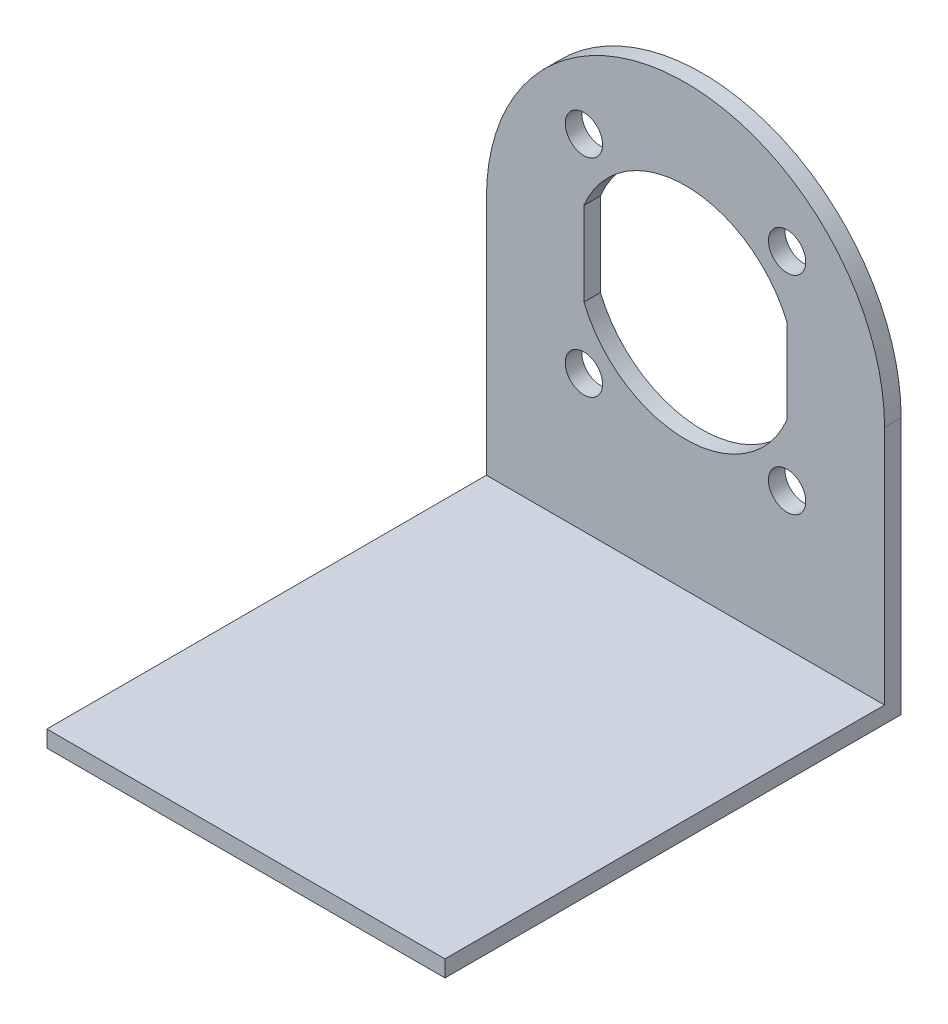
ISO-10303-21;
HEADER;
FILE_DESCRIPTION(('STEP AP214'),'2;1');
FILE_NAME('part.step','',(''),(''),'','','');
FILE_SCHEMA(('AUTOMOTIVE_DESIGN { 1 0 10303 214 1 1 1 1 }'));
ENDSEC;
DATA;
#1=APPLICATION_CONTEXT('core data for automotive mechanical design processes');
#2=APPLICATION_PROTOCOL_DEFINITION('international standard','automotive_design',2000,#1);
#3=PRODUCT_CONTEXT('',#1,'mechanical');
#4=PRODUCT('Part','Part','',(#3));
#5=PRODUCT_RELATED_PRODUCT_CATEGORY('part','',(#4));
#6=PRODUCT_DEFINITION_FORMATION('','',#4);
#7=PRODUCT_DEFINITION_CONTEXT('part definition',#1,'design');
#8=PRODUCT_DEFINITION('design','',#6,#7);
#9=PRODUCT_DEFINITION_SHAPE('','',#8);
#10=(LENGTH_UNIT() NAMED_UNIT(*) SI_UNIT(.MILLI.,.METRE.));
#11=(NAMED_UNIT(*) PLANE_ANGLE_UNIT() SI_UNIT($,.RADIAN.));
#12=(NAMED_UNIT(*) SI_UNIT($,.STERADIAN.) SOLID_ANGLE_UNIT());
#13=UNCERTAINTY_MEASURE_WITH_UNIT(LENGTH_MEASURE(1.E-05),#10,'distance_accuracy_value','');
#14=(GEOMETRIC_REPRESENTATION_CONTEXT(3) GLOBAL_UNCERTAINTY_ASSIGNED_CONTEXT((#13)) GLOBAL_UNIT_ASSIGNED_CONTEXT((#10,
#11,#12)) REPRESENTATION_CONTEXT('',''));
#15=CARTESIAN_POINT('',(0.,0.,0.));
#16=DIRECTION('',(0.,0.,1.));
#17=DIRECTION('',(1.,0.,0.));
#18=AXIS2_PLACEMENT_3D('',#15,#16,#17);
#19=CARTESIAN_POINT('',(-38.7711228765328,2.,-34.1893008273645));
#20=DIRECTION('',(0.,0.,1.));
#21=DIRECTION('',(1.,0.,0.));
#22=AXIS2_PLACEMENT_3D('',#19,#20,#21);
#23=PLANE('',#22);
#24=CARTESIAN_POINT('',(-2.52112287653278,43.49749974995,-34.1893008273645));
#25=DIRECTION('',(0.,0.,1.));
#26=DIRECTION('',(1.,0.,0.));
#27=AXIS2_PLACEMENT_3D('',#24,#25,#26);
#28=CIRCLE('',#27,2.25);
#29=CARTESIAN_POINT('',(-0.271122876532779,43.49749974995,-34.1893008273645));
#30=VERTEX_POINT('',#29);
#31=EDGE_CURVE('E388',#30,#30,#28,.T.);
#32=ORIENTED_EDGE('',*,*,#31,.T.);
#33=EDGE_LOOP('',(#32));
#34=FACE_BOUND('',#33,.T.);
#35=CARTESIAN_POINT('',(-27.0211228765328,18.50250025005,-34.1893008273645));
#36=DIRECTION('',(0.,0.,1.));
#37=DIRECTION('',(1.,0.,0.));
#38=AXIS2_PLACEMENT_3D('',#35,#36,#37);
#39=CIRCLE('',#38,2.25);
#40=CARTESIAN_POINT('',(-24.7711228765328,18.50250025005,-34.1893008273645));
#41=VERTEX_POINT('',#40);
#42=EDGE_CURVE('E389',#41,#41,#39,.T.);
#43=ORIENTED_EDGE('',*,*,#42,.T.);
#44=EDGE_LOOP('',(#43));
#45=FACE_BOUND('',#44,.T.);
#46=CARTESIAN_POINT('',(-2.52112287653278,18.50250025005,-34.1893008273645));
#47=DIRECTION('',(0.,0.,1.));
#48=DIRECTION('',(1.,0.,0.));
#49=AXIS2_PLACEMENT_3D('',#46,#47,#48);
#50=CIRCLE('',#49,2.25);
#51=CARTESIAN_POINT('',(-0.27112287653278,18.50250025005,-34.1893008273645));
#52=VERTEX_POINT('',#51);
#53=EDGE_CURVE('E394',#52,#52,#50,.T.);
#54=ORIENTED_EDGE('',*,*,#53,.T.);
#55=EDGE_LOOP('',(#54));
#56=FACE_BOUND('',#55,.T.);
#57=CARTESIAN_POINT('',(-27.0211228765328,43.49749974995,-34.1893008273645));
#58=DIRECTION('',(0.,0.,1.));
#59=DIRECTION('',(1.,0.,0.));
#60=AXIS2_PLACEMENT_3D('',#57,#58,#59);
#61=CIRCLE('',#60,2.25);
#62=CARTESIAN_POINT('',(-24.7711228765328,43.49749974995,-34.1893008273645));
#63=VERTEX_POINT('',#62);
#64=EDGE_CURVE('E397',#63,#63,#61,.T.);
#65=ORIENTED_EDGE('',*,*,#64,.T.);
#66=EDGE_LOOP('',(#65));
#67=FACE_BOUND('',#66,.T.);
#68=DIRECTION('',(0.,1.,0.));
#69=VECTOR('',#68,1.);
#70=CARTESIAN_POINT('',(-27.0211228765328,2.,-34.1893008273645));
#71=LINE('',#70,#69);
#72=CARTESIAN_POINT('',(-27.0211228765328,25.950247530819,-34.1893008273645));
#73=VERTEX_POINT('',#72);
#74=CARTESIAN_POINT('',(-27.0211228765328,36.049752469181,-34.1893008273645));
#75=VERTEX_POINT('',#74);
#76=EDGE_CURVE('E159',#73,#75,#71,.T.);
#77=ORIENTED_EDGE('',*,*,#76,.F.);
#78=CARTESIAN_POINT('',(-14.7711228765328,31.,-34.1893008273645));
#79=DIRECTION('',(0.,0.,1.));
#80=DIRECTION('',(1.,0.,0.));
#81=AXIS2_PLACEMENT_3D('',#78,#79,#80);
#82=CIRCLE('',#81,13.25);
#83=CARTESIAN_POINT('',(-2.52112287653278,25.950247530819,-34.1893008273645));
#84=VERTEX_POINT('',#83);
#85=EDGE_CURVE('E161',#73,#84,#82,.T.);
#86=ORIENTED_EDGE('',*,*,#85,.T.);
#87=DIRECTION('',(0.,1.,0.));
#88=VECTOR('',#87,1.);
#89=CARTESIAN_POINT('',(-2.52112287653278,2.,-34.1893008273645));
#90=LINE('',#89,#88);
#91=CARTESIAN_POINT('',(-2.52112287653278,36.049752469181,-34.1893008273645));
#92=VERTEX_POINT('',#91);
#93=EDGE_CURVE('E154',#84,#92,#90,.T.);
#94=ORIENTED_EDGE('',*,*,#93,.T.);
#95=CARTESIAN_POINT('',(-14.7711228765328,31.,-34.1893008273645));
#96=DIRECTION('',(0.,0.,1.));
#97=DIRECTION('',(1.,0.,0.));
#98=AXIS2_PLACEMENT_3D('',#95,#96,#97);
#99=CIRCLE('',#98,13.25);
#100=EDGE_CURVE('E134',#92,#75,#99,.T.);
#101=ORIENTED_EDGE('',*,*,#100,.T.);
#102=EDGE_LOOP('',(#77,#86,#94,#101));
#103=FACE_BOUND('',#102,.T.);
#104=CARTESIAN_POINT('',(-14.7711228765328,31.,-34.1893008273645));
#105=DIRECTION('',(0.,0.,1.));
#106=DIRECTION('',(1.,0.,0.));
#107=AXIS2_PLACEMENT_3D('',#104,#105,#106);
#108=CIRCLE('',#107,24.);
#109=CARTESIAN_POINT('',(9.22887712346722,31.,-34.1893008273645));
#110=VERTEX_POINT('',#109);
#111=CARTESIAN_POINT('',(-38.7711228765328,31.,-34.1893008273645));
#112=VERTEX_POINT('',#111);
#113=EDGE_CURVE('E169',#110,#112,#108,.T.);
#114=ORIENTED_EDGE('',*,*,#113,.F.);
#115=DIRECTION('',(0.,-1.,0.));
#116=VECTOR('',#115,1.);
#117=CARTESIAN_POINT('',(9.22887712346722,2.,-34.1893008273645));
#118=LINE('',#117,#116);
#119=CARTESIAN_POINT('',(9.22887712346722,0.,-34.1893008273645));
#120=VERTEX_POINT('',#119);
#121=EDGE_CURVE('E198',#110,#120,#118,.T.);
#122=ORIENTED_EDGE('',*,*,#121,.T.);
#123=DIRECTION('',(-1.,0.,0.));
#124=VECTOR('',#123,1.);
#125=CARTESIAN_POINT('',(-38.7711228765328,0.,-34.1893008273645));
#126=LINE('',#125,#124);
#127=CARTESIAN_POINT('',(-38.7711228765328,0.,-34.1893008273645));
#128=VERTEX_POINT('',#127);
#129=EDGE_CURVE('E182',#120,#128,#126,.T.);
#130=ORIENTED_EDGE('',*,*,#129,.T.);
#131=DIRECTION('',(0.,-1.,0.));
#132=VECTOR('',#131,1.);
#133=CARTESIAN_POINT('',(-38.7711228765328,2.,-34.1893008273645));
#134=LINE('',#133,#132);
#135=EDGE_CURVE('E187',#112,#128,#134,.T.);
#136=ORIENTED_EDGE('',*,*,#135,.F.);
#137=EDGE_LOOP('',(#114,#122,#130,#136));
#138=FACE_BOUND('',#137,.T.);
#139=ADVANCED_FACE('F51',(#34,#45,#56,#67,#103,#138),#23,.F.);
#140=CARTESIAN_POINT('',(-38.7711228765328,55.,-32.1893008273645));
#141=DIRECTION('',(0.,0.,-1.));
#142=DIRECTION('',(-1.,0.,0.));
#143=AXIS2_PLACEMENT_3D('',#140,#141,#142);
#144=PLANE('',#143);
#145=CARTESIAN_POINT('',(-2.52112287653278,43.49749974995,-32.1893008273645));
#146=DIRECTION('',(0.,0.,1.));
#147=DIRECTION('',(1.,0.,0.));
#148=AXIS2_PLACEMENT_3D('',#145,#146,#147);
#149=CIRCLE('',#148,2.25);
#150=CARTESIAN_POINT('',(-0.271122876532779,43.49749974995,-32.1893008273645));
#151=VERTEX_POINT('',#150);
#152=EDGE_CURVE('E403',#151,#151,#149,.T.);
#153=ORIENTED_EDGE('',*,*,#152,.F.);
#154=EDGE_LOOP('',(#153));
#155=FACE_BOUND('',#154,.T.);
#156=CARTESIAN_POINT('',(-27.0211228765328,18.50250025005,-32.1893008273645));
#157=DIRECTION('',(0.,0.,1.));
#158=DIRECTION('',(1.,0.,0.));
#159=AXIS2_PLACEMENT_3D('',#156,#157,#158);
#160=CIRCLE('',#159,2.25);
#161=CARTESIAN_POINT('',(-24.7711228765328,18.50250025005,-32.1893008273645));
#162=VERTEX_POINT('',#161);
#163=EDGE_CURVE('E404',#162,#162,#160,.T.);
#164=ORIENTED_EDGE('',*,*,#163,.F.);
#165=EDGE_LOOP('',(#164));
#166=FACE_BOUND('',#165,.T.);
#167=CARTESIAN_POINT('',(-2.52112287653278,18.50250025005,-32.1893008273645));
#168=DIRECTION('',(0.,0.,1.));
#169=DIRECTION('',(1.,0.,0.));
#170=AXIS2_PLACEMENT_3D('',#167,#168,#169);
#171=CIRCLE('',#170,2.25);
#172=CARTESIAN_POINT('',(-0.27112287653278,18.50250025005,-32.1893008273645));
#173=VERTEX_POINT('',#172);
#174=EDGE_CURVE('E407',#173,#173,#171,.T.);
#175=ORIENTED_EDGE('',*,*,#174,.F.);
#176=EDGE_LOOP('',(#175));
#177=FACE_BOUND('',#176,.T.);
#178=CARTESIAN_POINT('',(-27.0211228765328,43.49749974995,-32.1893008273645));
#179=DIRECTION('',(0.,0.,1.));
#180=DIRECTION('',(1.,0.,0.));
#181=AXIS2_PLACEMENT_3D('',#178,#179,#180);
#182=CIRCLE('',#181,2.25);
#183=CARTESIAN_POINT('',(-24.7711228765328,43.49749974995,-32.1893008273645));
#184=VERTEX_POINT('',#183);
#185=EDGE_CURVE('E400',#184,#184,#182,.T.);
#186=ORIENTED_EDGE('',*,*,#185,.F.);
#187=EDGE_LOOP('',(#186));
#188=FACE_BOUND('',#187,.T.);
#189=DIRECTION('',(0.,1.,0.));
#190=VECTOR('',#189,1.);
#191=CARTESIAN_POINT('',(-2.52112287653278,25.950247530819,-32.1893008273645));
#192=LINE('',#191,#190);
#193=CARTESIAN_POINT('',(-2.52112287653278,25.950247530819,-32.1893008273645));
#194=VERTEX_POINT('',#193);
#195=CARTESIAN_POINT('',(-2.52112287653278,36.049752469181,-32.1893008273645));
#196=VERTEX_POINT('',#195);
#197=EDGE_CURVE('E140',#194,#196,#192,.T.);
#198=ORIENTED_EDGE('',*,*,#197,.F.);
#199=CARTESIAN_POINT('',(-14.7711228765328,31.,-32.1893008273645));
#200=DIRECTION('',(0.,0.,1.));
#201=DIRECTION('',(1.,0.,0.));
#202=AXIS2_PLACEMENT_3D('',#199,#200,#201);
#203=CIRCLE('',#202,13.25);
#204=CARTESIAN_POINT('',(-27.0211228765328,25.950247530819,-32.1893008273645));
#205=VERTEX_POINT('',#204);
#206=EDGE_CURVE('E74',#205,#194,#203,.T.);
#207=ORIENTED_EDGE('',*,*,#206,.F.);
#208=DIRECTION('',(0.,1.,0.));
#209=VECTOR('',#208,1.);
#210=CARTESIAN_POINT('',(-27.0211228765328,25.950247530819,-32.1893008273645));
#211=LINE('',#210,#209);
#212=CARTESIAN_POINT('',(-27.0211228765328,36.049752469181,-32.1893008273645));
#213=VERTEX_POINT('',#212);
#214=EDGE_CURVE('E147',#205,#213,#211,.T.);
#215=ORIENTED_EDGE('',*,*,#214,.T.);
#216=CARTESIAN_POINT('',(-14.7711228765328,31.,-32.1893008273645));
#217=DIRECTION('',(0.,0.,1.));
#218=DIRECTION('',(1.,0.,0.));
#219=AXIS2_PLACEMENT_3D('',#216,#217,#218);
#220=CIRCLE('',#219,13.25);
#221=EDGE_CURVE('E131',#196,#213,#220,.T.);
#222=ORIENTED_EDGE('',*,*,#221,.F.);
#223=EDGE_LOOP('',(#198,#207,#215,#222));
#224=FACE_BOUND('',#223,.T.);
#225=DIRECTION('',(0.,-1.,0.));
#226=VECTOR('',#225,1.);
#227=CARTESIAN_POINT('',(9.22887712346722,55.,-32.1893008273645));
#228=LINE('',#227,#226);
#229=CARTESIAN_POINT('',(9.22887712346722,31.,-32.1893008273645));
#230=VERTEX_POINT('',#229);
#231=CARTESIAN_POINT('',(9.22887712346722,2.,-32.1893008273645));
#232=VERTEX_POINT('',#231);
#233=EDGE_CURVE('E174',#230,#232,#228,.T.);
#234=ORIENTED_EDGE('',*,*,#233,.F.);
#235=CARTESIAN_POINT('',(-14.7711228765328,31.,-32.1893008273645));
#236=DIRECTION('',(0.,0.,1.));
#237=DIRECTION('',(1.,0.,0.));
#238=AXIS2_PLACEMENT_3D('',#235,#236,#237);
#239=CIRCLE('',#238,24.);
#240=CARTESIAN_POINT('',(-38.7711228765328,31.,-32.1893008273645));
#241=VERTEX_POINT('',#240);
#242=EDGE_CURVE('E164',#230,#241,#239,.T.);
#243=ORIENTED_EDGE('',*,*,#242,.T.);
#244=DIRECTION('',(0.,-1.,0.));
#245=VECTOR('',#244,1.);
#246=CARTESIAN_POINT('',(-38.7711228765328,55.,-32.1893008273645));
#247=LINE('',#246,#245);
#248=CARTESIAN_POINT('',(-38.7711228765328,2.,-32.1893008273645));
#249=VERTEX_POINT('',#248);
#250=EDGE_CURVE('E176',#241,#249,#247,.T.);
#251=ORIENTED_EDGE('',*,*,#250,.T.);
#252=DIRECTION('',(1.,0.,0.));
#253=VECTOR('',#252,1.);
#254=CARTESIAN_POINT('',(-38.7711228765328,2.,-32.1893008273645));
#255=LINE('',#254,#253);
#256=EDGE_CURVE('E171',#249,#232,#255,.T.);
#257=ORIENTED_EDGE('',*,*,#256,.T.);
#258=EDGE_LOOP('',(#234,#243,#251,#257));
#259=FACE_BOUND('',#258,.T.);
#260=ADVANCED_FACE('F144',(#155,#166,#177,#188,#224,#259),#144,.F.);
#261=CARTESIAN_POINT('',(-38.7711228765328,2.,-34.1893008273645));
#262=DIRECTION('',(1.,0.,0.));
#263=DIRECTION('',(0.,0.,-1.));
#264=AXIS2_PLACEMENT_3D('',#261,#262,#263);
#265=PLANE('',#264);
#266=DIRECTION('',(0.,0.,1.));
#267=VECTOR('',#266,1.);
#268=CARTESIAN_POINT('',(-38.7711228765328,31.,-85.1893008273645));
#269=LINE('',#268,#267);
#270=EDGE_CURVE('E167',#112,#241,#269,.T.);
#271=ORIENTED_EDGE('',*,*,#270,.F.);
#272=ORIENTED_EDGE('',*,*,#135,.T.);
#273=DIRECTION('',(0.,0.,1.));
#274=VECTOR('',#273,1.);
#275=CARTESIAN_POINT('',(-38.7711228765328,0.,-34.1893008273645));
#276=LINE('',#275,#274);
#277=CARTESIAN_POINT('',(-38.7711228765328,0.,20.8106991726355));
#278=VERTEX_POINT('',#277);
#279=EDGE_CURVE('E178',#128,#278,#276,.T.);
#280=ORIENTED_EDGE('',*,*,#279,.T.);
#281=DIRECTION('',(0.,-1.,0.));
#282=VECTOR('',#281,1.);
#283=CARTESIAN_POINT('',(-38.7711228765328,2.,20.8106991726355));
#284=LINE('',#283,#282);
#285=CARTESIAN_POINT('',(-38.7711228765328,2.,20.8106991726355));
#286=VERTEX_POINT('',#285);
#287=EDGE_CURVE('E59',#286,#278,#284,.T.);
#288=ORIENTED_EDGE('',*,*,#287,.F.);
#289=DIRECTION('',(0.,0.,1.));
#290=VECTOR('',#289,1.);
#291=CARTESIAN_POINT('',(-38.7711228765328,2.,-34.1893008273645));
#292=LINE('',#291,#290);
#293=EDGE_CURVE('E179',#249,#286,#292,.T.);
#294=ORIENTED_EDGE('',*,*,#293,.F.);
#295=ORIENTED_EDGE('',*,*,#250,.F.);
#296=EDGE_LOOP('',(#271,#272,#280,#288,#294,#295));
#297=FACE_BOUND('',#296,.T.);
#298=ADVANCED_FACE('F53',(#297),#265,.F.);
#299=CARTESIAN_POINT('',(-38.7711228765328,2.,20.8106991726355));
#300=DIRECTION('',(0.,0.,-1.));
#301=DIRECTION('',(-1.,0.,0.));
#302=AXIS2_PLACEMENT_3D('',#299,#300,#301);
#303=PLANE('',#302);
#304=DIRECTION('',(1.,0.,0.));
#305=VECTOR('',#304,1.);
#306=CARTESIAN_POINT('',(-38.7711228765328,0.,20.8106991726355));
#307=LINE('',#306,#305);
#308=CARTESIAN_POINT('',(9.22887712346722,0.,20.8106991726355));
#309=VERTEX_POINT('',#308);
#310=EDGE_CURVE('E190',#278,#309,#307,.T.);
#311=ORIENTED_EDGE('',*,*,#310,.T.);
#312=DIRECTION('',(0.,-1.,0.));
#313=VECTOR('',#312,1.);
#314=CARTESIAN_POINT('',(9.22887712346722,2.,20.8106991726355));
#315=LINE('',#314,#313);
#316=CARTESIAN_POINT('',(9.22887712346722,2.,20.8106991726355));
#317=VERTEX_POINT('',#316);
#318=EDGE_CURVE('E200',#317,#309,#315,.T.);
#319=ORIENTED_EDGE('',*,*,#318,.F.);
#320=DIRECTION('',(1.,0.,0.));
#321=VECTOR('',#320,1.);
#322=CARTESIAN_POINT('',(-38.7711228765328,2.,20.8106991726355));
#323=LINE('',#322,#321);
#324=EDGE_CURVE('E181',#286,#317,#323,.T.);
#325=ORIENTED_EDGE('',*,*,#324,.F.);
#326=ORIENTED_EDGE('',*,*,#287,.T.);
#327=EDGE_LOOP('',(#311,#319,#325,#326));
#328=FACE_BOUND('',#327,.T.);
#329=ADVANCED_FACE('F206',(#328),#303,.F.);
#330=CARTESIAN_POINT('',(9.22887712346722,2.,-34.1893008273645));
#331=DIRECTION('',(-1.,0.,0.));
#332=DIRECTION('',(0.,0.,1.));
#333=AXIS2_PLACEMENT_3D('',#330,#331,#332);
#334=PLANE('',#333);
#335=ORIENTED_EDGE('',*,*,#121,.F.);
#336=DIRECTION('',(0.,0.,1.));
#337=VECTOR('',#336,1.);
#338=CARTESIAN_POINT('',(9.22887712346722,31.,-85.1893008273645));
#339=LINE('',#338,#337);
#340=EDGE_CURVE('E12',#110,#230,#339,.T.);
#341=ORIENTED_EDGE('',*,*,#340,.T.);
#342=ORIENTED_EDGE('',*,*,#233,.T.);
#343=DIRECTION('',(0.,0.,-1.));
#344=VECTOR('',#343,1.);
#345=CARTESIAN_POINT('',(9.22887712346722,2.,-34.1893008273645));
#346=LINE('',#345,#344);
#347=EDGE_CURVE('E184',#317,#232,#346,.T.);
#348=ORIENTED_EDGE('',*,*,#347,.F.);
#349=ORIENTED_EDGE('',*,*,#318,.T.);
#350=DIRECTION('',(0.,0.,-1.));
#351=VECTOR('',#350,1.);
#352=CARTESIAN_POINT('',(9.22887712346722,0.,-34.1893008273645));
#353=LINE('',#352,#351);
#354=EDGE_CURVE('E192',#309,#120,#353,.T.);
#355=ORIENTED_EDGE('',*,*,#354,.T.);
#356=EDGE_LOOP('',(#335,#341,#342,#348,#349,#355));
#357=FACE_BOUND('',#356,.T.);
#358=ADVANCED_FACE('F219',(#357),#334,.F.);
#359=CARTESIAN_POINT('',(0.,2.,0.));
#360=DIRECTION('',(0.,1.,0.));
#361=DIRECTION('',(0.,0.,1.));
#362=AXIS2_PLACEMENT_3D('',#359,#360,#361);
#363=PLANE('',#362);
#364=ORIENTED_EDGE('',*,*,#256,.F.);
#365=ORIENTED_EDGE('',*,*,#293,.T.);
#366=ORIENTED_EDGE('',*,*,#324,.T.);
#367=ORIENTED_EDGE('',*,*,#347,.T.);
#368=EDGE_LOOP('',(#364,#365,#366,#367));
#369=FACE_BOUND('',#368,.T.);
#370=ADVANCED_FACE('F224',(#369),#363,.T.);
#371=CARTESIAN_POINT('',(0.,0.,0.));
#372=DIRECTION('',(0.,1.,0.));
#373=DIRECTION('',(0.,0.,1.));
#374=AXIS2_PLACEMENT_3D('',#371,#372,#373);
#375=PLANE('',#374);
#376=ORIENTED_EDGE('',*,*,#279,.F.);
#377=ORIENTED_EDGE('',*,*,#129,.F.);
#378=ORIENTED_EDGE('',*,*,#354,.F.);
#379=ORIENTED_EDGE('',*,*,#310,.F.);
#380=EDGE_LOOP('',(#376,#377,#378,#379));
#381=FACE_BOUND('',#380,.T.);
#382=ADVANCED_FACE('F215',(#381),#375,.F.);
#383=CARTESIAN_POINT('',(-14.7711228765328,31.,-85.1893008273645));
#384=DIRECTION('',(0.,0.,1.));
#385=DIRECTION('',(1.,0.,0.));
#386=AXIS2_PLACEMENT_3D('',#383,#384,#385);
#387=CYLINDRICAL_SURFACE('',#386,24.);
#388=ORIENTED_EDGE('',*,*,#113,.T.);
#389=ORIENTED_EDGE('',*,*,#270,.T.);
#390=ORIENTED_EDGE('',*,*,#242,.F.);
#391=ORIENTED_EDGE('',*,*,#340,.F.);
#392=EDGE_LOOP('',(#388,#389,#390,#391));
#393=FACE_BOUND('',#392,.T.);
#394=ADVANCED_FACE('F229',(#393),#387,.T.);
#395=CARTESIAN_POINT('',(-14.7711228765328,31.,-85.1893008273645));
#396=DIRECTION('',(0.,0.,1.));
#397=DIRECTION('',(1.,0.,0.));
#398=AXIS2_PLACEMENT_3D('',#395,#396,#397);
#399=CYLINDRICAL_SURFACE('',#398,13.25);
#400=DIRECTION('',(0.,0.,1.));
#401=VECTOR('',#400,1.);
#402=CARTESIAN_POINT('',(-27.0211228765328,25.950247530819,-85.1893008273645));
#403=LINE('',#402,#401);
#404=EDGE_CURVE('E152',#73,#205,#403,.T.);
#405=ORIENTED_EDGE('',*,*,#404,.T.);
#406=ORIENTED_EDGE('',*,*,#206,.T.);
#407=DIRECTION('',(0.,0.,1.));
#408=VECTOR('',#407,1.);
#409=CARTESIAN_POINT('',(-2.52112287653278,25.950247530819,-85.1893008273645));
#410=LINE('',#409,#408);
#411=EDGE_CURVE('E137',#84,#194,#410,.T.);
#412=ORIENTED_EDGE('',*,*,#411,.F.);
#413=ORIENTED_EDGE('',*,*,#85,.F.);
#414=EDGE_LOOP('',(#405,#406,#412,#413));
#415=FACE_BOUND('',#414,.T.);
#416=ADVANCED_FACE('F231',(#415),#399,.F.);
#417=CARTESIAN_POINT('',(-27.0211228765328,25.950247530819,-85.1893008273645));
#418=DIRECTION('',(1.,0.,0.));
#419=DIRECTION('',(0.,0.,-1.));
#420=AXIS2_PLACEMENT_3D('',#417,#418,#419);
#421=PLANE('',#420);
#422=ORIENTED_EDGE('',*,*,#76,.T.);
#423=DIRECTION('',(0.,0.,1.));
#424=VECTOR('',#423,1.);
#425=CARTESIAN_POINT('',(-27.0211228765328,36.049752469181,-85.1893008273645));
#426=LINE('',#425,#424);
#427=EDGE_CURVE('E136',#75,#213,#426,.T.);
#428=ORIENTED_EDGE('',*,*,#427,.T.);
#429=ORIENTED_EDGE('',*,*,#214,.F.);
#430=ORIENTED_EDGE('',*,*,#404,.F.);
#431=EDGE_LOOP('',(#422,#428,#429,#430));
#432=FACE_BOUND('',#431,.T.);
#433=ADVANCED_FACE('F237',(#432),#421,.T.);
#434=CARTESIAN_POINT('',(-14.7711228765328,31.,-85.1893008273645));
#435=DIRECTION('',(0.,0.,1.));
#436=DIRECTION('',(1.,0.,0.));
#437=AXIS2_PLACEMENT_3D('',#434,#435,#436);
#438=CYLINDRICAL_SURFACE('',#437,13.25);
#439=DIRECTION('',(0.,0.,1.));
#440=VECTOR('',#439,1.);
#441=CARTESIAN_POINT('',(-2.52112287653278,36.049752469181,-85.1893008273645));
#442=LINE('',#441,#440);
#443=EDGE_CURVE('E66',#92,#196,#442,.T.);
#444=ORIENTED_EDGE('',*,*,#443,.T.);
#445=ORIENTED_EDGE('',*,*,#221,.T.);
#446=ORIENTED_EDGE('',*,*,#427,.F.);
#447=ORIENTED_EDGE('',*,*,#100,.F.);
#448=EDGE_LOOP('',(#444,#445,#446,#447));
#449=FACE_BOUND('',#448,.T.);
#450=ADVANCED_FACE('F128',(#449),#438,.F.);
#451=CARTESIAN_POINT('',(-2.52112287653278,25.950247530819,-85.1893008273645));
#452=DIRECTION('',(1.,0.,0.));
#453=DIRECTION('',(0.,0.,-1.));
#454=AXIS2_PLACEMENT_3D('',#451,#452,#453);
#455=PLANE('',#454);
#456=ORIENTED_EDGE('',*,*,#411,.T.);
#457=ORIENTED_EDGE('',*,*,#197,.T.);
#458=ORIENTED_EDGE('',*,*,#443,.F.);
#459=ORIENTED_EDGE('',*,*,#93,.F.);
#460=EDGE_LOOP('',(#456,#457,#458,#459));
#461=FACE_BOUND('',#460,.T.);
#462=ADVANCED_FACE('F141',(#461),#455,.F.);
#463=CARTESIAN_POINT('',(-27.0211228765328,43.49749974995,-85.1893008273645));
#464=DIRECTION('',(0.,0.,1.));
#465=DIRECTION('',(1.,0.,0.));
#466=AXIS2_PLACEMENT_3D('',#463,#464,#465);
#467=CYLINDRICAL_SURFACE('',#466,2.25);
#468=ORIENTED_EDGE('',*,*,#185,.T.);
#469=EDGE_LOOP('',(#468));
#470=FACE_BOUND('',#469,.T.);
#471=ORIENTED_EDGE('',*,*,#64,.F.);
#472=EDGE_LOOP('',(#471));
#473=FACE_BOUND('',#472,.T.);
#474=ADVANCED_FACE('F274',(#470,#473),#467,.F.);
#475=CARTESIAN_POINT('',(-2.52112287653278,18.50250025005,-85.1893008273645));
#476=DIRECTION('',(0.,0.,1.));
#477=DIRECTION('',(1.,0.,0.));
#478=AXIS2_PLACEMENT_3D('',#475,#476,#477);
#479=CYLINDRICAL_SURFACE('',#478,2.25);
#480=ORIENTED_EDGE('',*,*,#174,.T.);
#481=EDGE_LOOP('',(#480));
#482=FACE_BOUND('',#481,.T.);
#483=ORIENTED_EDGE('',*,*,#53,.F.);
#484=EDGE_LOOP('',(#483));
#485=FACE_BOUND('',#484,.T.);
#486=ADVANCED_FACE('F279',(#482,#485),#479,.F.);
#487=CARTESIAN_POINT('',(-27.0211228765328,18.50250025005,-85.1893008273645));
#488=DIRECTION('',(0.,0.,1.));
#489=DIRECTION('',(1.,0.,0.));
#490=AXIS2_PLACEMENT_3D('',#487,#488,#489);
#491=CYLINDRICAL_SURFACE('',#490,2.25);
#492=ORIENTED_EDGE('',*,*,#163,.T.);
#493=EDGE_LOOP('',(#492));
#494=FACE_BOUND('',#493,.T.);
#495=ORIENTED_EDGE('',*,*,#42,.F.);
#496=EDGE_LOOP('',(#495));
#497=FACE_BOUND('',#496,.T.);
#498=ADVANCED_FACE('F291',(#494,#497),#491,.F.);
#499=CARTESIAN_POINT('',(-2.52112287653278,43.49749974995,-85.1893008273645));
#500=DIRECTION('',(0.,0.,1.));
#501=DIRECTION('',(1.,0.,0.));
#502=AXIS2_PLACEMENT_3D('',#499,#500,#501);
#503=CYLINDRICAL_SURFACE('',#502,2.25);
#504=ORIENTED_EDGE('',*,*,#152,.T.);
#505=EDGE_LOOP('',(#504));
#506=FACE_BOUND('',#505,.T.);
#507=ORIENTED_EDGE('',*,*,#31,.F.);
#508=EDGE_LOOP('',(#507));
#509=FACE_BOUND('',#508,.T.);
#510=ADVANCED_FACE('F301',(#506,#509),#503,.F.);
#511=CLOSED_SHELL('',(#139,#260,#298,#329,#358,#370,#382,#394,#416,#433,#450,#462,#474,#486,
#498,#510));
#512=MANIFOLD_SOLID_BREP('B2',#511);
#513=ADVANCED_BREP_SHAPE_REPRESENTATION('',(#18,#512),#14);
#514=SHAPE_DEFINITION_REPRESENTATION(#9,#513);
ENDSEC;
END-ISO-10303-21;
